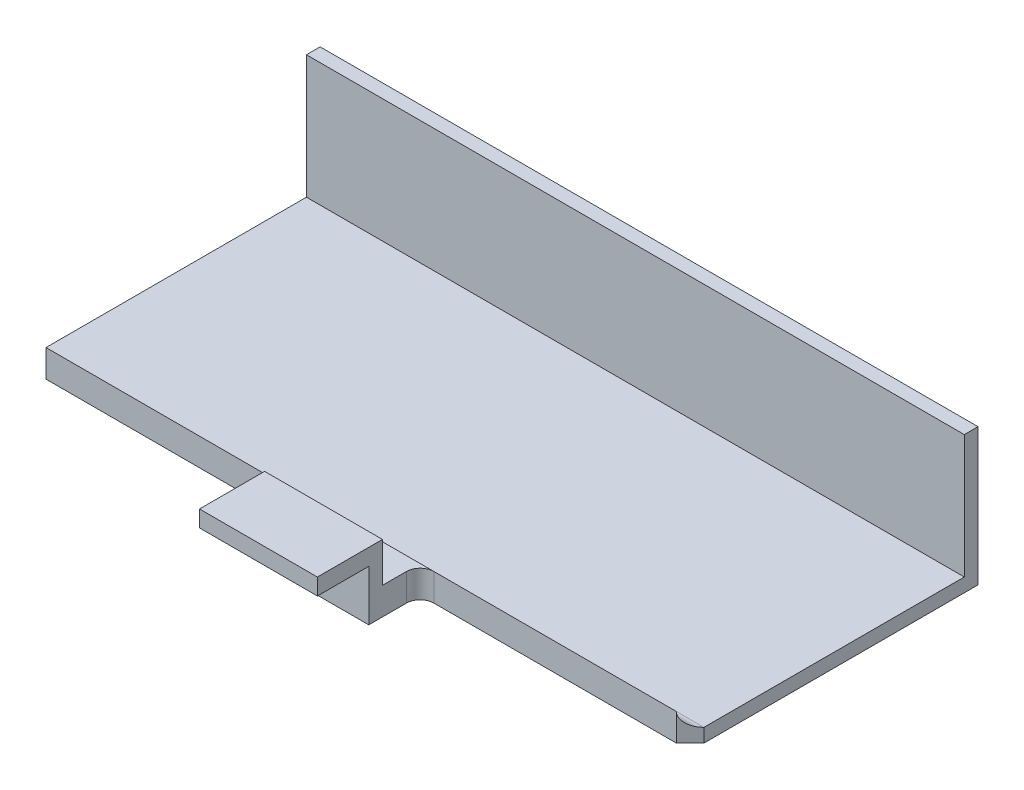
ISO-10303-21;
HEADER;
FILE_DESCRIPTION(('STEP AP214'),'2;1');
FILE_NAME('part.step','',(''),(''),'','','');
FILE_SCHEMA(('AUTOMOTIVE_DESIGN { 1 0 10303 214 1 1 1 1 }'));
ENDSEC;
DATA;
#1=APPLICATION_CONTEXT('core data for automotive mechanical design processes');
#2=APPLICATION_PROTOCOL_DEFINITION('international standard','automotive_design',2000,#1);
#3=PRODUCT_CONTEXT('',#1,'mechanical');
#4=PRODUCT('Part','Part','',(#3));
#5=PRODUCT_RELATED_PRODUCT_CATEGORY('part','',(#4));
#6=PRODUCT_DEFINITION_FORMATION('','',#4);
#7=PRODUCT_DEFINITION_CONTEXT('part definition',#1,'design');
#8=PRODUCT_DEFINITION('design','',#6,#7);
#9=PRODUCT_DEFINITION_SHAPE('','',#8);
#10=(LENGTH_UNIT() NAMED_UNIT(*) SI_UNIT(.MILLI.,.METRE.));
#11=(NAMED_UNIT(*) PLANE_ANGLE_UNIT() SI_UNIT($,.RADIAN.));
#12=(NAMED_UNIT(*) SI_UNIT($,.STERADIAN.) SOLID_ANGLE_UNIT());
#13=UNCERTAINTY_MEASURE_WITH_UNIT(LENGTH_MEASURE(1.E-05),#10,'distance_accuracy_value','');
#14=(GEOMETRIC_REPRESENTATION_CONTEXT(3) GLOBAL_UNCERTAINTY_ASSIGNED_CONTEXT((#13)) GLOBAL_UNIT_ASSIGNED_CONTEXT((#10,
#11,#12)) REPRESENTATION_CONTEXT('',''));
#15=CARTESIAN_POINT('',(0.,0.,0.));
#16=DIRECTION('',(0.,0.,1.));
#17=DIRECTION('',(1.,0.,0.));
#18=AXIS2_PLACEMENT_3D('',#15,#16,#17);
#19=CARTESIAN_POINT('',(-42.9999999999999,20.,101.114394423161));
#20=DIRECTION('',(0.,-1.,0.));
#21=DIRECTION('',(0.,0.,-1.));
#22=AXIS2_PLACEMENT_3D('',#19,#20,#21);
#23=PLANE('',#22);
#24=DIRECTION('',(-1.,0.,0.));
#25=VECTOR('',#24,1.);
#26=CARTESIAN_POINT('',(-43.,20.,53.6143944231613));
#27=LINE('',#26,#25);
#28=CARTESIAN_POINT('',(43.,20.,53.6143944231613));
#29=VERTEX_POINT('',#28);
#30=CARTESIAN_POINT('',(-43.,20.,53.6143944231613));
#31=VERTEX_POINT('',#30);
#32=EDGE_CURVE('E222',#29,#31,#27,.T.);
#33=ORIENTED_EDGE('',*,*,#32,.F.);
#34=DIRECTION('',(0.,0.,-1.));
#35=VECTOR('',#34,1.);
#36=CARTESIAN_POINT('',(43.,20.,101.114394423161));
#37=LINE('',#36,#35);
#38=CARTESIAN_POINT('',(43.,20.,36.1143944231614));
#39=VERTEX_POINT('',#38);
#40=EDGE_CURVE('E254',#29,#39,#37,.T.);
#41=ORIENTED_EDGE('',*,*,#40,.T.);
#42=CARTESIAN_POINT('',(53.,20.,36.1143944231614));
#43=DIRECTION('',(0.,-1.,0.));
#44=DIRECTION('',(0.,0.,-1.));
#45=AXIS2_PLACEMENT_3D('',#42,#43,#44);
#46=CIRCLE('',#45,10.);
#47=CARTESIAN_POINT('',(53.,20.,26.1143944231614));
#48=VERTEX_POINT('',#47);
#49=EDGE_CURVE('E303',#39,#48,#46,.T.);
#50=ORIENTED_EDGE('',*,*,#49,.T.);
#51=DIRECTION('',(-1.,0.,0.));
#52=VECTOR('',#51,1.);
#53=CARTESIAN_POINT('',(-42.9999999999999,20.,26.1143944231614));
#54=LINE('',#53,#52);
#55=CARTESIAN_POINT('',(-53.,20.,26.1143944231614));
#56=VERTEX_POINT('',#55);
#57=EDGE_CURVE('E248',#48,#56,#54,.T.);
#58=ORIENTED_EDGE('',*,*,#57,.T.);
#59=CARTESIAN_POINT('',(-53.,20.,36.1143944231614));
#60=DIRECTION('',(0.,-1.,0.));
#61=DIRECTION('',(0.,0.,-1.));
#62=AXIS2_PLACEMENT_3D('',#59,#60,#61);
#63=CIRCLE('',#62,10.);
#64=CARTESIAN_POINT('',(-42.9999999999999,20.,36.1143944231614));
#65=VERTEX_POINT('',#64);
#66=EDGE_CURVE('E299',#56,#65,#63,.T.);
#67=ORIENTED_EDGE('',*,*,#66,.T.);
#68=DIRECTION('',(0.,0.,-1.));
#69=VECTOR('',#68,1.);
#70=CARTESIAN_POINT('',(-42.9999999999999,20.,101.114394423161));
#71=LINE('',#70,#69);
#72=EDGE_CURVE('E261',#31,#65,#71,.T.);
#73=ORIENTED_EDGE('',*,*,#72,.F.);
#74=EDGE_LOOP('',(#33,#41,#50,#58,#67,#73));
#75=FACE_BOUND('',#74,.T.);
#76=ADVANCED_FACE('F38',(#75),#23,.F.);
#77=CARTESIAN_POINT('',(240.,0.,26.1143944231614));
#78=DIRECTION('',(1.,0.,0.));
#79=DIRECTION('',(0.,0.,-1.));
#80=AXIS2_PLACEMENT_3D('',#77,#78,#79);
#81=PLANE('',#80);
#82=DIRECTION('',(0.,0.,-1.));
#83=VECTOR('',#82,1.);
#84=CARTESIAN_POINT('',(240.,10.,26.1143944231614));
#85=LINE('',#84,#83);
#86=CARTESIAN_POINT('',(240.,10.,16.1143944231614));
#87=VERTEX_POINT('',#86);
#88=CARTESIAN_POINT('',(240.,10.,-173.885605576839));
#89=VERTEX_POINT('',#88);
#90=EDGE_CURVE('E267',#87,#89,#85,.T.);
#91=ORIENTED_EDGE('',*,*,#90,.F.);
#92=DIRECTION('',(0.,-1.,0.));
#93=VECTOR('',#92,1.);
#94=CARTESIAN_POINT('',(240.,0.,16.1143944231614));
#95=LINE('',#94,#93);
#96=CARTESIAN_POINT('',(240.,0.,16.1143944231614));
#97=VERTEX_POINT('',#96);
#98=EDGE_CURVE('E171',#87,#97,#95,.T.);
#99=ORIENTED_EDGE('',*,*,#98,.T.);
#100=DIRECTION('',(0.,0.,-1.));
#101=VECTOR('',#100,1.);
#102=CARTESIAN_POINT('',(240.,0.,26.1143944231614));
#103=LINE('',#102,#101);
#104=CARTESIAN_POINT('',(240.,0.,-183.885605576839));
#105=VERTEX_POINT('',#104);
#106=EDGE_CURVE('E163',#97,#105,#103,.T.);
#107=ORIENTED_EDGE('',*,*,#106,.T.);
#108=DIRECTION('',(0.,-1.,0.));
#109=VECTOR('',#108,1.);
#110=CARTESIAN_POINT('',(240.,0.,-183.885605576839));
#111=LINE('',#110,#109);
#112=CARTESIAN_POINT('',(240.,100.,-183.885605576839));
#113=VERTEX_POINT('',#112);
#114=EDGE_CURVE('E169',#113,#105,#111,.T.);
#115=ORIENTED_EDGE('',*,*,#114,.F.);
#116=DIRECTION('',(0.,0.,1.));
#117=VECTOR('',#116,1.);
#118=CARTESIAN_POINT('',(240.,100.,-183.885605576839));
#119=LINE('',#118,#117);
#120=CARTESIAN_POINT('',(240.,100.,-173.885605576839));
#121=VERTEX_POINT('',#120);
#122=EDGE_CURVE('E199',#113,#121,#119,.T.);
#123=ORIENTED_EDGE('',*,*,#122,.T.);
#124=DIRECTION('',(0.,-1.,0.));
#125=VECTOR('',#124,1.);
#126=CARTESIAN_POINT('',(240.,0.,-173.885605576839));
#127=LINE('',#126,#125);
#128=EDGE_CURVE('E200',#121,#89,#127,.T.);
#129=ORIENTED_EDGE('',*,*,#128,.T.);
#130=EDGE_LOOP('',(#91,#99,#107,#115,#123,#129));
#131=FACE_BOUND('',#130,.T.);
#132=ADVANCED_FACE('F166',(#131),#81,.T.);
#133=CARTESIAN_POINT('',(-43.,0.,26.1143944231614));
#134=DIRECTION('',(0.,0.,1.));
#135=DIRECTION('',(1.,0.,0.));
#136=AXIS2_PLACEMENT_3D('',#133,#134,#135);
#137=PLANE('',#136);
#138=DIRECTION('',(0.,1.,0.));
#139=VECTOR('',#138,1.);
#140=CARTESIAN_POINT('',(230.,0.,26.1143944231614));
#141=LINE('',#140,#139);
#142=CARTESIAN_POINT('',(230.,0.,26.1143944231614));
#143=VERTEX_POINT('',#142);
#144=CARTESIAN_POINT('',(230.,20.,26.1143944231614));
#145=VERTEX_POINT('',#144);
#146=EDGE_CURVE('E60',#143,#145,#141,.T.);
#147=ORIENTED_EDGE('',*,*,#146,.T.);
#148=DIRECTION('',(-1.,0.,0.));
#149=VECTOR('',#148,1.);
#150=CARTESIAN_POINT('',(141.5,20.,26.1143944231614));
#151=LINE('',#150,#149);
#152=EDGE_CURVE('E310',#145,#48,#151,.T.);
#153=ORIENTED_EDGE('',*,*,#152,.T.);
#154=DIRECTION('',(0.,1.,0.));
#155=VECTOR('',#154,1.);
#156=CARTESIAN_POINT('',(53.0000000000001,0.,26.1143944231614));
#157=LINE('',#156,#155);
#158=CARTESIAN_POINT('',(53.0000000000001,0.,26.1143944231614));
#159=VERTEX_POINT('',#158);
#160=EDGE_CURVE('E295',#48,#159,#157,.F.);
#161=ORIENTED_EDGE('',*,*,#160,.T.);
#162=DIRECTION('',(1.,0.,0.));
#163=VECTOR('',#162,1.);
#164=CARTESIAN_POINT('',(-43.,0.,26.1143944231614));
#165=LINE('',#164,#163);
#166=EDGE_CURVE('E176',#159,#143,#165,.T.);
#167=ORIENTED_EDGE('',*,*,#166,.T.);
#168=EDGE_LOOP('',(#147,#153,#161,#167));
#169=FACE_BOUND('',#168,.T.);
#170=ADVANCED_FACE('F351',(#169),#137,.T.);
#171=CARTESIAN_POINT('',(-43.,0.,-173.885605576839));
#172=DIRECTION('',(-1.,0.,0.));
#173=DIRECTION('',(0.,0.,1.));
#174=AXIS2_PLACEMENT_3D('',#171,#172,#173);
#175=PLANE('',#174);
#176=ORIENTED_EDGE('',*,*,#72,.T.);
#177=DIRECTION('',(0.,1.,0.));
#178=VECTOR('',#177,1.);
#179=CARTESIAN_POINT('',(-43.,0.,36.1143944231614));
#180=LINE('',#179,#178);
#181=CARTESIAN_POINT('',(-43.,0.,36.1143944231614));
#182=VERTEX_POINT('',#181);
#183=EDGE_CURVE('E291',#65,#182,#180,.F.);
#184=ORIENTED_EDGE('',*,*,#183,.T.);
#185=DIRECTION('',(0.,0.,1.));
#186=VECTOR('',#185,1.);
#187=CARTESIAN_POINT('',(-43.,0.,-173.885605576839));
#188=LINE('',#187,#186);
#189=CARTESIAN_POINT('',(-43.,0.,63.6143944231614));
#190=VERTEX_POINT('',#189);
#191=EDGE_CURVE('E265',#182,#190,#188,.T.);
#192=ORIENTED_EDGE('',*,*,#191,.T.);
#193=DIRECTION('',(0.,-1.,0.));
#194=VECTOR('',#193,1.);
#195=CARTESIAN_POINT('',(-43.,37.,63.6143944231614));
#196=LINE('',#195,#194);
#197=CARTESIAN_POINT('',(-43.,37.,63.6143944231614));
#198=VERTEX_POINT('',#197);
#199=EDGE_CURVE('E211',#198,#190,#196,.T.);
#200=ORIENTED_EDGE('',*,*,#199,.F.);
#201=DIRECTION('',(0.,0.,-1.));
#202=VECTOR('',#201,1.);
#203=CARTESIAN_POINT('',(-43.,37.,101.114394423161));
#204=LINE('',#203,#202);
#205=CARTESIAN_POINT('',(-43.,37.,101.114394423161));
#206=VERTEX_POINT('',#205);
#207=EDGE_CURVE('E208',#206,#198,#204,.T.);
#208=ORIENTED_EDGE('',*,*,#207,.F.);
#209=DIRECTION('',(0.,-1.,0.));
#210=VECTOR('',#209,1.);
#211=CARTESIAN_POINT('',(-42.9999999999999,0.,101.114394423161));
#212=LINE('',#211,#210);
#213=CARTESIAN_POINT('',(-43.,49.,101.114394423161));
#214=VERTEX_POINT('',#213);
#215=EDGE_CURVE('E249',#214,#206,#212,.T.);
#216=ORIENTED_EDGE('',*,*,#215,.F.);
#217=DIRECTION('',(0.,0.,1.));
#218=VECTOR('',#217,1.);
#219=CARTESIAN_POINT('',(-43.,49.,101.114394423161));
#220=LINE('',#219,#218);
#221=CARTESIAN_POINT('',(-43.,49.,53.6143944231613));
#222=VERTEX_POINT('',#221);
#223=EDGE_CURVE('E223',#222,#214,#220,.T.);
#224=ORIENTED_EDGE('',*,*,#223,.F.);
#225=DIRECTION('',(0.,-1.,0.));
#226=VECTOR('',#225,1.);
#227=CARTESIAN_POINT('',(-43.,49.,53.6143944231613));
#228=LINE('',#227,#226);
#229=EDGE_CURVE('E233',#222,#31,#228,.T.);
#230=ORIENTED_EDGE('',*,*,#229,.T.);
#231=EDGE_LOOP('',(#176,#184,#192,#200,#208,#216,#224,#230));
#232=FACE_BOUND('',#231,.T.);
#233=ADVANCED_FACE('F359',(#232),#175,.T.);
#234=CARTESIAN_POINT('',(0.,0.,0.));
#235=DIRECTION('',(0.,1.,0.));
#236=DIRECTION('',(0.,0.,1.));
#237=AXIS2_PLACEMENT_3D('',#234,#235,#236);
#238=PLANE('',#237);
#239=DIRECTION('',(1.,0.,0.));
#240=VECTOR('',#239,1.);
#241=CARTESIAN_POINT('',(-240.,0.,26.1143944231614));
#242=LINE('',#241,#240);
#243=CARTESIAN_POINT('',(-230.,0.,26.1143944231614));
#244=VERTEX_POINT('',#243);
#245=CARTESIAN_POINT('',(-53.,0.,26.1143944231614));
#246=VERTEX_POINT('',#245);
#247=EDGE_CURVE('E245',#244,#246,#242,.T.);
#248=ORIENTED_EDGE('',*,*,#247,.F.);
#249=DIRECTION('',(0.707106781186549,0.,0.707106781186546));
#250=VECTOR('',#249,1.);
#251=CARTESIAN_POINT('',(-240.,0.,16.1143944231614));
#252=LINE('',#251,#250);
#253=CARTESIAN_POINT('',(-240.,0.,16.1143944231614));
#254=VERTEX_POINT('',#253);
#255=EDGE_CURVE('E284',#244,#254,#252,.F.);
#256=ORIENTED_EDGE('',*,*,#255,.T.);
#257=DIRECTION('',(0.,0.,1.));
#258=VECTOR('',#257,1.);
#259=CARTESIAN_POINT('',(-240.,0.,26.1143944231614));
#260=LINE('',#259,#258);
#261=CARTESIAN_POINT('',(-240.,0.,-183.885605576839));
#262=VERTEX_POINT('',#261);
#263=EDGE_CURVE('E183',#262,#254,#260,.T.);
#264=ORIENTED_EDGE('',*,*,#263,.F.);
#265=DIRECTION('',(-1.,0.,0.));
#266=VECTOR('',#265,1.);
#267=CARTESIAN_POINT('',(240.,0.,-183.885605576839));
#268=LINE('',#267,#266);
#269=EDGE_CURVE('E179',#105,#262,#268,.T.);
#270=ORIENTED_EDGE('',*,*,#269,.F.);
#271=ORIENTED_EDGE('',*,*,#106,.F.);
#272=DIRECTION('',(0.707106781186545,0.,-0.70710678118655));
#273=VECTOR('',#272,1.);
#274=CARTESIAN_POINT('',(230.,0.,26.1143944231614));
#275=LINE('',#274,#273);
#276=EDGE_CURVE('E282',#97,#143,#275,.F.);
#277=ORIENTED_EDGE('',*,*,#276,.T.);
#278=ORIENTED_EDGE('',*,*,#166,.F.);
#279=CARTESIAN_POINT('',(53.,0.,36.1143944231614));
#280=DIRECTION('',(0.,1.,0.));
#281=DIRECTION('',(0.,0.,1.));
#282=AXIS2_PLACEMENT_3D('',#279,#280,#281);
#283=CIRCLE('',#282,10.);
#284=CARTESIAN_POINT('',(43.,0.,36.1143944231614));
#285=VERTEX_POINT('',#284);
#286=EDGE_CURVE('E306',#159,#285,#283,.T.);
#287=ORIENTED_EDGE('',*,*,#286,.T.);
#288=DIRECTION('',(0.,0.,-1.));
#289=VECTOR('',#288,1.);
#290=CARTESIAN_POINT('',(43.,0.,101.114394423161));
#291=LINE('',#290,#289);
#292=CARTESIAN_POINT('',(43.,0.,63.6143944231614));
#293=VERTEX_POINT('',#292);
#294=EDGE_CURVE('E258',#293,#285,#291,.T.);
#295=ORIENTED_EDGE('',*,*,#294,.F.);
#296=DIRECTION('',(-1.,0.,0.));
#297=VECTOR('',#296,1.);
#298=CARTESIAN_POINT('',(240.,0.,63.6143944231614));
#299=LINE('',#298,#297);
#300=EDGE_CURVE('E215',#293,#190,#299,.T.);
#301=ORIENTED_EDGE('',*,*,#300,.T.);
#302=ORIENTED_EDGE('',*,*,#191,.F.);
#303=CARTESIAN_POINT('',(-53.,0.,36.1143944231614));
#304=DIRECTION('',(0.,1.,0.));
#305=DIRECTION('',(0.,0.,1.));
#306=AXIS2_PLACEMENT_3D('',#303,#304,#305);
#307=CIRCLE('',#306,10.);
#308=EDGE_CURVE('E301',#182,#246,#307,.T.);
#309=ORIENTED_EDGE('',*,*,#308,.T.);
#310=EDGE_LOOP('',(#248,#256,#264,#270,#271,#277,#278,#287,#295,#301,#302,#309));
#311=FACE_BOUND('',#310,.T.);
#312=ADVANCED_FACE('F181',(#311),#238,.F.);
#313=CARTESIAN_POINT('',(0.,10.,0.));
#314=DIRECTION('',(0.,1.,0.));
#315=DIRECTION('',(0.,0.,1.));
#316=AXIS2_PLACEMENT_3D('',#313,#314,#315);
#317=PLANE('',#316);
#318=DIRECTION('',(0.,0.,-1.));
#319=VECTOR('',#318,1.);
#320=CARTESIAN_POINT('',(-240.,10.,-173.885605576839));
#321=LINE('',#320,#319);
#322=CARTESIAN_POINT('',(-240.,10.,16.1143944231614));
#323=VERTEX_POINT('',#322);
#324=CARTESIAN_POINT('',(-240.,10.,-173.885605576839));
#325=VERTEX_POINT('',#324);
#326=EDGE_CURVE('E241',#323,#325,#321,.T.);
#327=ORIENTED_EDGE('',*,*,#326,.F.);
#328=DIRECTION('',(1.,0.,0.));
#329=VECTOR('',#328,1.);
#330=CARTESIAN_POINT('',(43.,10.,16.1143944231614));
#331=LINE('',#330,#329);
#332=EDGE_CURVE('E297',#323,#87,#331,.T.);
#333=ORIENTED_EDGE('',*,*,#332,.T.);
#334=ORIENTED_EDGE('',*,*,#90,.T.);
#335=DIRECTION('',(-1.,0.,0.));
#336=VECTOR('',#335,1.);
#337=CARTESIAN_POINT('',(240.,10.,-173.885605576839));
#338=LINE('',#337,#336);
#339=EDGE_CURVE('E264',#89,#325,#338,.T.);
#340=ORIENTED_EDGE('',*,*,#339,.T.);
#341=EDGE_LOOP('',(#327,#333,#334,#340));
#342=FACE_BOUND('',#341,.T.);
#343=ADVANCED_FACE('F327',(#342),#317,.T.);
#344=CARTESIAN_POINT('',(43.,20.,101.114394423161));
#345=DIRECTION('',(-1.,0.,0.));
#346=DIRECTION('',(0.,-1.,0.));
#347=AXIS2_PLACEMENT_3D('',#344,#345,#346);
#348=PLANE('',#347);
#349=ORIENTED_EDGE('',*,*,#294,.T.);
#350=DIRECTION('',(0.,1.,0.));
#351=VECTOR('',#350,1.);
#352=CARTESIAN_POINT('',(43.,20.,36.1143944231614));
#353=LINE('',#352,#351);
#354=EDGE_CURVE('E293',#285,#39,#353,.T.);
#355=ORIENTED_EDGE('',*,*,#354,.T.);
#356=ORIENTED_EDGE('',*,*,#40,.F.);
#357=DIRECTION('',(0.,-1.,0.));
#358=VECTOR('',#357,1.);
#359=CARTESIAN_POINT('',(43.,49.,53.6143944231614));
#360=LINE('',#359,#358);
#361=CARTESIAN_POINT('',(43.,49.,53.6143944231614));
#362=VERTEX_POINT('',#361);
#363=EDGE_CURVE('E238',#362,#29,#360,.T.);
#364=ORIENTED_EDGE('',*,*,#363,.F.);
#365=DIRECTION('',(0.,0.,-1.));
#366=VECTOR('',#365,1.);
#367=CARTESIAN_POINT('',(43.,49.,53.6143944231614));
#368=LINE('',#367,#366);
#369=CARTESIAN_POINT('',(43.,49.,101.114394423161));
#370=VERTEX_POINT('',#369);
#371=EDGE_CURVE('E229',#370,#362,#368,.T.);
#372=ORIENTED_EDGE('',*,*,#371,.F.);
#373=DIRECTION('',(0.,1.,0.));
#374=VECTOR('',#373,1.);
#375=CARTESIAN_POINT('',(43.,20.,101.114394423161));
#376=LINE('',#375,#374);
#377=CARTESIAN_POINT('',(43.,37.,101.114394423161));
#378=VERTEX_POINT('',#377);
#379=EDGE_CURVE('E252',#378,#370,#376,.T.);
#380=ORIENTED_EDGE('',*,*,#379,.F.);
#381=DIRECTION('',(0.,0.,-1.));
#382=VECTOR('',#381,1.);
#383=CARTESIAN_POINT('',(43.,37.,101.114394423161));
#384=LINE('',#383,#382);
#385=CARTESIAN_POINT('',(43.,37.,63.6143944231614));
#386=VERTEX_POINT('',#385);
#387=EDGE_CURVE('E218',#378,#386,#384,.T.);
#388=ORIENTED_EDGE('',*,*,#387,.T.);
#389=DIRECTION('',(0.,-1.,0.));
#390=VECTOR('',#389,1.);
#391=CARTESIAN_POINT('',(43.,20.,63.6143944231614));
#392=LINE('',#391,#390);
#393=EDGE_CURVE('E275',#386,#293,#392,.T.);
#394=ORIENTED_EDGE('',*,*,#393,.T.);
#395=EDGE_LOOP('',(#349,#355,#356,#364,#372,#380,#388,#394));
#396=FACE_BOUND('',#395,.T.);
#397=ADVANCED_FACE('F355',(#396),#348,.F.);
#398=CARTESIAN_POINT('',(0.,0.,101.114394423161));
#399=DIRECTION('',(0.,0.,-1.));
#400=DIRECTION('',(-1.,0.,0.));
#401=AXIS2_PLACEMENT_3D('',#398,#399,#400);
#402=PLANE('',#401);
#403=ORIENTED_EDGE('',*,*,#215,.T.);
#404=DIRECTION('',(1.,0.,0.));
#405=VECTOR('',#404,1.);
#406=CARTESIAN_POINT('',(0.,37.,101.114394423161));
#407=LINE('',#406,#405);
#408=EDGE_CURVE('E175',#206,#378,#407,.T.);
#409=ORIENTED_EDGE('',*,*,#408,.T.);
#410=ORIENTED_EDGE('',*,*,#379,.T.);
#411=DIRECTION('',(1.,0.,0.));
#412=VECTOR('',#411,1.);
#413=CARTESIAN_POINT('',(43.,49.,101.114394423161));
#414=LINE('',#413,#412);
#415=EDGE_CURVE('E226',#214,#370,#414,.T.);
#416=ORIENTED_EDGE('',*,*,#415,.F.);
#417=EDGE_LOOP('',(#403,#409,#410,#416));
#418=FACE_BOUND('',#417,.T.);
#419=ADVANCED_FACE('F419',(#418),#402,.F.);
#420=CARTESIAN_POINT('',(-240.,10.,26.1143944231614));
#421=DIRECTION('',(0.,0.,-1.));
#422=DIRECTION('',(-1.,0.,0.));
#423=AXIS2_PLACEMENT_3D('',#420,#421,#422);
#424=PLANE('',#423);
#425=ORIENTED_EDGE('',*,*,#247,.T.);
#426=DIRECTION('',(0.,1.,0.));
#427=VECTOR('',#426,1.);
#428=CARTESIAN_POINT('',(-53.,10.,26.1143944231614));
#429=LINE('',#428,#427);
#430=EDGE_CURVE('E288',#246,#56,#429,.T.);
#431=ORIENTED_EDGE('',*,*,#430,.T.);
#432=DIRECTION('',(-1.,0.,0.));
#433=VECTOR('',#432,1.);
#434=CARTESIAN_POINT('',(-141.5,20.,26.1143944231614));
#435=LINE('',#434,#433);
#436=CARTESIAN_POINT('',(-230.,20.,26.1143944231614));
#437=VERTEX_POINT('',#436);
#438=EDGE_CURVE('E46',#56,#437,#435,.T.);
#439=ORIENTED_EDGE('',*,*,#438,.T.);
#440=DIRECTION('',(0.,-1.,0.));
#441=VECTOR('',#440,1.);
#442=CARTESIAN_POINT('',(-230.,10.,26.1143944231614));
#443=LINE('',#442,#441);
#444=EDGE_CURVE('E52',#437,#244,#443,.T.);
#445=ORIENTED_EDGE('',*,*,#444,.T.);
#446=EDGE_LOOP('',(#425,#431,#439,#445));
#447=FACE_BOUND('',#446,.T.);
#448=ADVANCED_FACE('F314',(#447),#424,.F.);
#449=CARTESIAN_POINT('',(-240.,0.,0.));
#450=DIRECTION('',(1.,0.,0.));
#451=DIRECTION('',(0.,0.,-1.));
#452=AXIS2_PLACEMENT_3D('',#449,#450,#451);
#453=PLANE('',#452);
#454=ORIENTED_EDGE('',*,*,#263,.T.);
#455=DIRECTION('',(0.,1.,0.));
#456=VECTOR('',#455,1.);
#457=CARTESIAN_POINT('',(-240.,0.,16.1143944231614));
#458=LINE('',#457,#456);
#459=EDGE_CURVE('E278',#254,#323,#458,.T.);
#460=ORIENTED_EDGE('',*,*,#459,.T.);
#461=ORIENTED_EDGE('',*,*,#326,.T.);
#462=DIRECTION('',(0.,1.,0.));
#463=VECTOR('',#462,1.);
#464=CARTESIAN_POINT('',(-240.,0.,-173.885605576839));
#465=LINE('',#464,#463);
#466=CARTESIAN_POINT('',(-240.,100.,-173.885605576839));
#467=VERTEX_POINT('',#466);
#468=EDGE_CURVE('E194',#325,#467,#465,.T.);
#469=ORIENTED_EDGE('',*,*,#468,.T.);
#470=DIRECTION('',(0.,0.,1.));
#471=VECTOR('',#470,1.);
#472=CARTESIAN_POINT('',(-240.,100.,-183.885605576839));
#473=LINE('',#472,#471);
#474=CARTESIAN_POINT('',(-240.,100.,-183.885605576839));
#475=VERTEX_POINT('',#474);
#476=EDGE_CURVE('E205',#475,#467,#473,.T.);
#477=ORIENTED_EDGE('',*,*,#476,.F.);
#478=DIRECTION('',(0.,1.,0.));
#479=VECTOR('',#478,1.);
#480=CARTESIAN_POINT('',(-240.,0.,-183.885605576839));
#481=LINE('',#480,#479);
#482=EDGE_CURVE('E186',#262,#475,#481,.T.);
#483=ORIENTED_EDGE('',*,*,#482,.F.);
#484=EDGE_LOOP('',(#454,#460,#461,#469,#477,#483));
#485=FACE_BOUND('',#484,.T.);
#486=ADVANCED_FACE('F325',(#485),#453,.F.);
#487=CARTESIAN_POINT('',(-43.,49.,53.6143944231613));
#488=DIRECTION('',(0.,0.,1.));
#489=DIRECTION('',(1.,0.,0.));
#490=AXIS2_PLACEMENT_3D('',#487,#488,#489);
#491=PLANE('',#490);
#492=ORIENTED_EDGE('',*,*,#32,.T.);
#493=ORIENTED_EDGE('',*,*,#229,.F.);
#494=DIRECTION('',(-1.,0.,0.));
#495=VECTOR('',#494,1.);
#496=CARTESIAN_POINT('',(-43.,49.,53.6143944231613));
#497=LINE('',#496,#495);
#498=EDGE_CURVE('E231',#362,#222,#497,.T.);
#499=ORIENTED_EDGE('',*,*,#498,.F.);
#500=ORIENTED_EDGE('',*,*,#363,.T.);
#501=EDGE_LOOP('',(#492,#493,#499,#500));
#502=FACE_BOUND('',#501,.T.);
#503=ADVANCED_FACE('F412',(#502),#491,.F.);
#504=CARTESIAN_POINT('',(0.,49.,0.));
#505=DIRECTION('',(0.,-1.,0.));
#506=DIRECTION('',(0.,0.,-1.));
#507=AXIS2_PLACEMENT_3D('',#504,#505,#506);
#508=PLANE('',#507);
#509=ORIENTED_EDGE('',*,*,#223,.T.);
#510=ORIENTED_EDGE('',*,*,#415,.T.);
#511=ORIENTED_EDGE('',*,*,#371,.T.);
#512=ORIENTED_EDGE('',*,*,#498,.T.);
#513=EDGE_LOOP('',(#509,#510,#511,#512));
#514=FACE_BOUND('',#513,.T.);
#515=ADVANCED_FACE('F416',(#514),#508,.F.);
#516=CARTESIAN_POINT('',(240.,37.,63.6143944231614));
#517=DIRECTION('',(0.,0.,-1.));
#518=DIRECTION('',(-1.,0.,0.));
#519=AXIS2_PLACEMENT_3D('',#516,#517,#518);
#520=PLANE('',#519);
#521=DIRECTION('',(-1.,0.,0.));
#522=VECTOR('',#521,1.);
#523=CARTESIAN_POINT('',(240.,37.,63.6143944231614));
#524=LINE('',#523,#522);
#525=EDGE_CURVE('E214',#386,#198,#524,.T.);
#526=ORIENTED_EDGE('',*,*,#525,.T.);
#527=ORIENTED_EDGE('',*,*,#199,.T.);
#528=ORIENTED_EDGE('',*,*,#300,.F.);
#529=ORIENTED_EDGE('',*,*,#393,.F.);
#530=EDGE_LOOP('',(#526,#527,#528,#529));
#531=FACE_BOUND('',#530,.T.);
#532=ADVANCED_FACE('F401',(#531),#520,.F.);
#533=CARTESIAN_POINT('',(240.,37.,101.114394423161));
#534=DIRECTION('',(0.,1.,0.));
#535=DIRECTION('',(0.,0.,1.));
#536=AXIS2_PLACEMENT_3D('',#533,#534,#535);
#537=PLANE('',#536);
#538=ORIENTED_EDGE('',*,*,#408,.F.);
#539=ORIENTED_EDGE('',*,*,#207,.T.);
#540=ORIENTED_EDGE('',*,*,#525,.F.);
#541=ORIENTED_EDGE('',*,*,#387,.F.);
#542=EDGE_LOOP('',(#538,#539,#540,#541));
#543=FACE_BOUND('',#542,.T.);
#544=ADVANCED_FACE('F374',(#543),#537,.F.);
#545=CARTESIAN_POINT('',(-240.,0.,16.1143944231614));
#546=DIRECTION('',(0.707106781186545,0.,-0.707106781186549));
#547=DIRECTION('',(0.,1.,0.));
#548=AXIS2_PLACEMENT_3D('',#545,#546,#547);
#549=PLANE('',#548);
#550=ORIENTED_EDGE('',*,*,#255,.F.);
#551=ORIENTED_EDGE('',*,*,#444,.F.);
#552=CARTESIAN_POINT('',(-240.,20.,16.1143944231614));
#553=DIRECTION('',(0.707106781186545,0.,-0.707106781186549));
#554=DIRECTION('',(-0.707106781186549,0.,-0.707106781186546));
#555=AXIS2_PLACEMENT_3D('',#552,#553,#554);
#556=ELLIPSE('',#555,14.142135623731,10.);
#557=EDGE_CURVE('E11',#437,#323,#556,.T.);
#558=ORIENTED_EDGE('',*,*,#557,.T.);
#559=ORIENTED_EDGE('',*,*,#459,.F.);
#560=EDGE_LOOP('',(#550,#551,#558,#559));
#561=FACE_BOUND('',#560,.T.);
#562=ADVANCED_FACE('F322',(#561),#549,.F.);
#563=CARTESIAN_POINT('',(230.,0.,26.1143944231614));
#564=DIRECTION('',(-0.70710678118655,0.,-0.707106781186545));
#565=DIRECTION('',(0.,1.,0.));
#566=AXIS2_PLACEMENT_3D('',#563,#564,#565);
#567=PLANE('',#566);
#568=ORIENTED_EDGE('',*,*,#276,.F.);
#569=ORIENTED_EDGE('',*,*,#98,.F.);
#570=CARTESIAN_POINT('',(240.,20.,16.1143944231614));
#571=DIRECTION('',(-0.70710678118655,0.,-0.707106781186545));
#572=DIRECTION('',(-0.707106781186545,0.,0.70710678118655));
#573=AXIS2_PLACEMENT_3D('',#570,#571,#572);
#574=ELLIPSE('',#573,14.1421356237309,10.);
#575=EDGE_CURVE('E308',#87,#145,#574,.T.);
#576=ORIENTED_EDGE('',*,*,#575,.T.);
#577=ORIENTED_EDGE('',*,*,#146,.F.);
#578=EDGE_LOOP('',(#568,#569,#576,#577));
#579=FACE_BOUND('',#578,.T.);
#580=ADVANCED_FACE('F373',(#579),#567,.F.);
#581=CARTESIAN_POINT('',(53.,20.,36.1143944231614));
#582=DIRECTION('',(0.,1.,0.));
#583=DIRECTION('',(-1.,0.,0.));
#584=AXIS2_PLACEMENT_3D('',#581,#582,#583);
#585=CYLINDRICAL_SURFACE('',#584,10.);
#586=ORIENTED_EDGE('',*,*,#160,.F.);
#587=ORIENTED_EDGE('',*,*,#49,.F.);
#588=ORIENTED_EDGE('',*,*,#354,.F.);
#589=ORIENTED_EDGE('',*,*,#286,.F.);
#590=EDGE_LOOP('',(#586,#587,#588,#589));
#591=FACE_BOUND('',#590,.T.);
#592=ADVANCED_FACE('F40',(#591),#585,.F.);
#593=CARTESIAN_POINT('',(0.,20.,16.1143944231614));
#594=DIRECTION('',(-1.,0.,0.));
#595=DIRECTION('',(0.,0.,1.));
#596=AXIS2_PLACEMENT_3D('',#593,#594,#595);
#597=CYLINDRICAL_SURFACE('',#596,10.);
#598=ORIENTED_EDGE('',*,*,#557,.F.);
#599=ORIENTED_EDGE('',*,*,#438,.F.);
#600=ORIENTED_EDGE('',*,*,#57,.F.);
#601=ORIENTED_EDGE('',*,*,#152,.F.);
#602=ORIENTED_EDGE('',*,*,#575,.F.);
#603=ORIENTED_EDGE('',*,*,#332,.F.);
#604=EDGE_LOOP('',(#598,#599,#600,#601,#602,#603));
#605=FACE_BOUND('',#604,.T.);
#606=ADVANCED_FACE('F319',(#605),#597,.F.);
#607=CARTESIAN_POINT('',(-53.,10.,36.1143944231614));
#608=DIRECTION('',(0.,1.,0.));
#609=DIRECTION('',(0.,0.,1.));
#610=AXIS2_PLACEMENT_3D('',#607,#608,#609);
#611=CYLINDRICAL_SURFACE('',#610,10.);
#612=ORIENTED_EDGE('',*,*,#308,.F.);
#613=ORIENTED_EDGE('',*,*,#183,.F.);
#614=ORIENTED_EDGE('',*,*,#66,.F.);
#615=ORIENTED_EDGE('',*,*,#430,.F.);
#616=EDGE_LOOP('',(#612,#613,#614,#615));
#617=FACE_BOUND('',#616,.T.);
#618=ADVANCED_FACE('F342',(#617),#611,.F.);
#619=CARTESIAN_POINT('',(0.,0.,-173.885605576839));
#620=DIRECTION('',(0.,0.,1.));
#621=DIRECTION('',(1.,0.,0.));
#622=AXIS2_PLACEMENT_3D('',#619,#620,#621);
#623=PLANE('',#622);
#624=ORIENTED_EDGE('',*,*,#339,.F.);
#625=ORIENTED_EDGE('',*,*,#128,.F.);
#626=DIRECTION('',(1.,0.,0.));
#627=VECTOR('',#626,1.);
#628=CARTESIAN_POINT('',(240.,100.,-173.885605576839));
#629=LINE('',#628,#627);
#630=EDGE_CURVE('E192',#467,#121,#629,.T.);
#631=ORIENTED_EDGE('',*,*,#630,.F.);
#632=ORIENTED_EDGE('',*,*,#468,.F.);
#633=EDGE_LOOP('',(#624,#625,#631,#632));
#634=FACE_BOUND('',#633,.T.);
#635=ADVANCED_FACE('F330',(#634),#623,.T.);
#636=CARTESIAN_POINT('',(240.,100.,-183.885605576839));
#637=DIRECTION('',(0.,-1.,0.));
#638=DIRECTION('',(0.,0.,-1.));
#639=AXIS2_PLACEMENT_3D('',#636,#637,#638);
#640=PLANE('',#639);
#641=ORIENTED_EDGE('',*,*,#630,.T.);
#642=ORIENTED_EDGE('',*,*,#122,.F.);
#643=DIRECTION('',(1.,0.,0.));
#644=VECTOR('',#643,1.);
#645=CARTESIAN_POINT('',(240.,100.,-183.885605576839));
#646=LINE('',#645,#644);
#647=EDGE_CURVE('E190',#475,#113,#646,.T.);
#648=ORIENTED_EDGE('',*,*,#647,.F.);
#649=ORIENTED_EDGE('',*,*,#476,.T.);
#650=EDGE_LOOP('',(#641,#642,#648,#649));
#651=FACE_BOUND('',#650,.T.);
#652=ADVANCED_FACE('F333',(#651),#640,.F.);
#653=CARTESIAN_POINT('',(0.,0.,-183.885605576839));
#654=DIRECTION('',(0.,0.,1.));
#655=DIRECTION('',(1.,0.,0.));
#656=AXIS2_PLACEMENT_3D('',#653,#654,#655);
#657=PLANE('',#656);
#658=ORIENTED_EDGE('',*,*,#114,.T.);
#659=ORIENTED_EDGE('',*,*,#269,.T.);
#660=ORIENTED_EDGE('',*,*,#482,.T.);
#661=ORIENTED_EDGE('',*,*,#647,.T.);
#662=EDGE_LOOP('',(#658,#659,#660,#661));
#663=FACE_BOUND('',#662,.T.);
#664=ADVANCED_FACE('F188',(#663),#657,.F.);
#665=CLOSED_SHELL('',(#76,#132,#170,#233,#312,#343,#397,#419,#448,#486,#503,#515,#532,#544,#562,
#580,#592,#606,#618,#635,#652,#664));
#666=MANIFOLD_SOLID_BREP('B2',#665);
#667=ADVANCED_BREP_SHAPE_REPRESENTATION('',(#18,#666),#14);
#668=SHAPE_DEFINITION_REPRESENTATION(#9,#667);
ENDSEC;
END-ISO-10303-21;
